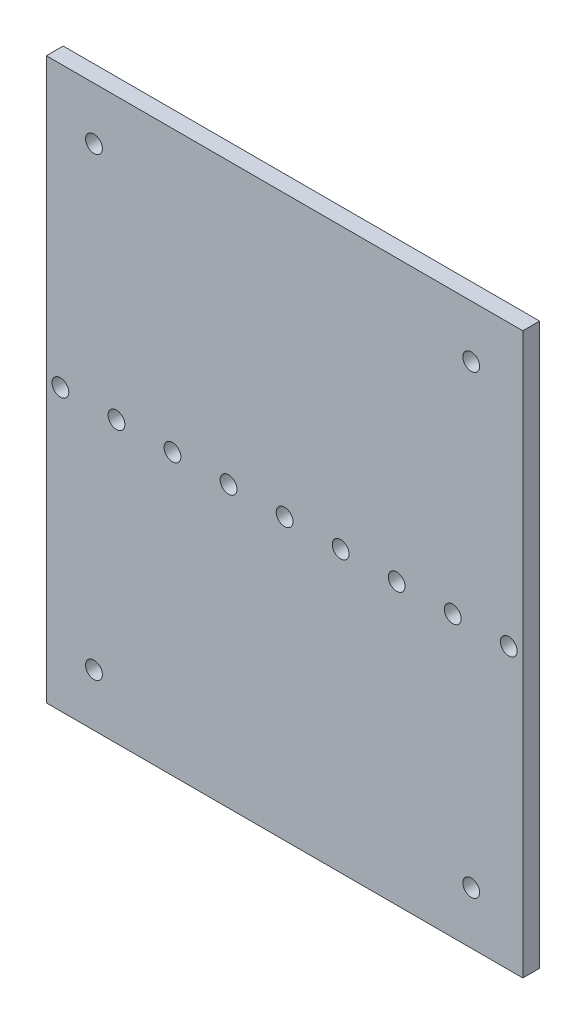
ISO-10303-21;
HEADER;
FILE_DESCRIPTION(('STEP AP214'),'2;1');
FILE_NAME('part.step','',(''),(''),'','','');
FILE_SCHEMA(('AUTOMOTIVE_DESIGN { 1 0 10303 214 1 1 1 1 }'));
ENDSEC;
DATA;
#1=APPLICATION_CONTEXT('core data for automotive mechanical design processes');
#2=APPLICATION_PROTOCOL_DEFINITION('international standard','automotive_design',2000,#1);
#3=PRODUCT_CONTEXT('',#1,'mechanical');
#4=PRODUCT('Part','Part','',(#3));
#5=PRODUCT_RELATED_PRODUCT_CATEGORY('part','',(#4));
#6=PRODUCT_DEFINITION_FORMATION('','',#4);
#7=PRODUCT_DEFINITION_CONTEXT('part definition',#1,'design');
#8=PRODUCT_DEFINITION('design','',#6,#7);
#9=PRODUCT_DEFINITION_SHAPE('','',#8);
#10=(LENGTH_UNIT() NAMED_UNIT(*) SI_UNIT(.MILLI.,.METRE.));
#11=(NAMED_UNIT(*) PLANE_ANGLE_UNIT() SI_UNIT($,.RADIAN.));
#12=(NAMED_UNIT(*) SI_UNIT($,.STERADIAN.) SOLID_ANGLE_UNIT());
#13=UNCERTAINTY_MEASURE_WITH_UNIT(LENGTH_MEASURE(1.E-05),#10,'distance_accuracy_value','');
#14=(GEOMETRIC_REPRESENTATION_CONTEXT(3) GLOBAL_UNCERTAINTY_ASSIGNED_CONTEXT((#13)) GLOBAL_UNIT_ASSIGNED_CONTEXT((#10,
#11,#12)) REPRESENTATION_CONTEXT('',''));
#15=CARTESIAN_POINT('',(0.,0.,0.));
#16=DIRECTION('',(0.,0.,1.));
#17=DIRECTION('',(1.,0.,0.));
#18=AXIS2_PLACEMENT_3D('',#15,#16,#17);
#19=CARTESIAN_POINT('',(85.,50.,3.));
#20=DIRECTION('',(-1.,0.,0.));
#21=DIRECTION('',(0.,-1.,0.));
#22=AXIS2_PLACEMENT_3D('',#19,#20,#21);
#23=PLANE('',#22);
#24=DIRECTION('',(0.,1.,0.));
#25=VECTOR('',#24,1.);
#26=CARTESIAN_POINT('',(85.,50.,0.));
#27=LINE('',#26,#25);
#28=CARTESIAN_POINT('',(85.,-50.,0.));
#29=VERTEX_POINT('',#28);
#30=CARTESIAN_POINT('',(85.,50.,0.));
#31=VERTEX_POINT('',#30);
#32=EDGE_CURVE('E114',#29,#31,#27,.T.);
#33=ORIENTED_EDGE('',*,*,#32,.T.);
#34=DIRECTION('',(0.,0.,-1.));
#35=VECTOR('',#34,1.);
#36=CARTESIAN_POINT('',(85.,50.,3.));
#37=LINE('',#36,#35);
#38=CARTESIAN_POINT('',(85.,50.,3.));
#39=VERTEX_POINT('',#38);
#40=EDGE_CURVE('E11',#39,#31,#37,.T.);
#41=ORIENTED_EDGE('',*,*,#40,.F.);
#42=DIRECTION('',(0.,1.,0.));
#43=VECTOR('',#42,1.);
#44=CARTESIAN_POINT('',(85.,50.,3.));
#45=LINE('',#44,#43);
#46=CARTESIAN_POINT('',(85.,-50.,3.));
#47=VERTEX_POINT('',#46);
#48=EDGE_CURVE('E97',#47,#39,#45,.T.);
#49=ORIENTED_EDGE('',*,*,#48,.F.);
#50=DIRECTION('',(0.,0.,-1.));
#51=VECTOR('',#50,1.);
#52=CARTESIAN_POINT('',(85.,-50.,3.));
#53=LINE('',#52,#51);
#54=EDGE_CURVE('E110',#47,#29,#53,.T.);
#55=ORIENTED_EDGE('',*,*,#54,.T.);
#56=EDGE_LOOP('',(#33,#41,#49,#55));
#57=FACE_BOUND('',#56,.T.);
#58=ADVANCED_FACE('F43',(#57),#23,.F.);
#59=CARTESIAN_POINT('',(0.,50.,3.));
#60=DIRECTION('',(0.,-1.,0.));
#61=DIRECTION('',(0.,0.,-1.));
#62=AXIS2_PLACEMENT_3D('',#59,#60,#61);
#63=PLANE('',#62);
#64=DIRECTION('',(-1.,0.,0.));
#65=VECTOR('',#64,1.);
#66=CARTESIAN_POINT('',(0.,50.,0.));
#67=LINE('',#66,#65);
#68=CARTESIAN_POINT('',(0.,50.,0.));
#69=VERTEX_POINT('',#68);
#70=EDGE_CURVE('E102',#31,#69,#67,.T.);
#71=ORIENTED_EDGE('',*,*,#70,.T.);
#72=DIRECTION('',(0.,0.,-1.));
#73=VECTOR('',#72,1.);
#74=CARTESIAN_POINT('',(0.,50.,3.));
#75=LINE('',#74,#73);
#76=CARTESIAN_POINT('',(0.,50.,3.));
#77=VERTEX_POINT('',#76);
#78=EDGE_CURVE('E53',#77,#69,#75,.T.);
#79=ORIENTED_EDGE('',*,*,#78,.F.);
#80=DIRECTION('',(-1.,0.,0.));
#81=VECTOR('',#80,1.);
#82=CARTESIAN_POINT('',(0.,50.,3.));
#83=LINE('',#82,#81);
#84=EDGE_CURVE('E92',#39,#77,#83,.T.);
#85=ORIENTED_EDGE('',*,*,#84,.F.);
#86=ORIENTED_EDGE('',*,*,#40,.T.);
#87=EDGE_LOOP('',(#71,#79,#85,#86));
#88=FACE_BOUND('',#87,.T.);
#89=ADVANCED_FACE('F101',(#88),#63,.F.);
#90=CARTESIAN_POINT('',(0.,50.,3.));
#91=DIRECTION('',(1.,0.,0.));
#92=DIRECTION('',(0.,1.,0.));
#93=AXIS2_PLACEMENT_3D('',#90,#91,#92);
#94=PLANE('',#93);
#95=DIRECTION('',(0.,-1.,0.));
#96=VECTOR('',#95,1.);
#97=CARTESIAN_POINT('',(0.,50.,0.));
#98=LINE('',#97,#96);
#99=CARTESIAN_POINT('',(0.,-50.,0.));
#100=VERTEX_POINT('',#99);
#101=EDGE_CURVE('E79',#69,#100,#98,.T.);
#102=ORIENTED_EDGE('',*,*,#101,.T.);
#103=DIRECTION('',(0.,0.,-1.));
#104=VECTOR('',#103,1.);
#105=CARTESIAN_POINT('',(0.,-50.,3.));
#106=LINE('',#105,#104);
#107=CARTESIAN_POINT('',(0.,-50.,3.));
#108=VERTEX_POINT('',#107);
#109=EDGE_CURVE('E104',#108,#100,#106,.T.);
#110=ORIENTED_EDGE('',*,*,#109,.F.);
#111=DIRECTION('',(0.,-1.,0.));
#112=VECTOR('',#111,1.);
#113=CARTESIAN_POINT('',(0.,50.,3.));
#114=LINE('',#113,#112);
#115=EDGE_CURVE('E95',#77,#108,#114,.T.);
#116=ORIENTED_EDGE('',*,*,#115,.F.);
#117=ORIENTED_EDGE('',*,*,#78,.T.);
#118=EDGE_LOOP('',(#102,#110,#116,#117));
#119=FACE_BOUND('',#118,.T.);
#120=ADVANCED_FACE('F106',(#119),#94,.F.);
#121=CARTESIAN_POINT('',(0.,-50.,3.));
#122=DIRECTION('',(0.,1.,0.));
#123=DIRECTION('',(0.,0.,1.));
#124=AXIS2_PLACEMENT_3D('',#121,#122,#123);
#125=PLANE('',#124);
#126=DIRECTION('',(1.,0.,0.));
#127=VECTOR('',#126,1.);
#128=CARTESIAN_POINT('',(0.,-50.,0.));
#129=LINE('',#128,#127);
#130=EDGE_CURVE('E85',#100,#29,#129,.T.);
#131=ORIENTED_EDGE('',*,*,#130,.T.);
#132=ORIENTED_EDGE('',*,*,#54,.F.);
#133=DIRECTION('',(1.,0.,0.));
#134=VECTOR('',#133,1.);
#135=CARTESIAN_POINT('',(0.,-50.,3.));
#136=LINE('',#135,#134);
#137=EDGE_CURVE('E62',#108,#47,#136,.T.);
#138=ORIENTED_EDGE('',*,*,#137,.F.);
#139=ORIENTED_EDGE('',*,*,#109,.T.);
#140=EDGE_LOOP('',(#131,#132,#138,#139));
#141=FACE_BOUND('',#140,.T.);
#142=ADVANCED_FACE('F209',(#141),#125,.F.);
#143=CARTESIAN_POINT('',(0.,0.,3.));
#144=DIRECTION('',(0.,0.,1.));
#145=DIRECTION('',(1.,0.,0.));
#146=AXIS2_PLACEMENT_3D('',#143,#144,#145);
#147=PLANE('',#146);
#148=CARTESIAN_POINT('',(2.49999999999999,-2.79318507107451E-13,3.));
#149=DIRECTION('',(0.,0.,1.));
#150=DIRECTION('',(1.,0.,0.));
#151=AXIS2_PLACEMENT_3D('',#148,#149,#150);
#152=CIRCLE('',#151,1.5);
#153=CARTESIAN_POINT('',(3.99999999999999,-2.79318507107451E-13,3.));
#154=VERTEX_POINT('',#153);
#155=EDGE_CURVE('E428',#154,#154,#152,.T.);
#156=ORIENTED_EDGE('',*,*,#155,.F.);
#157=EDGE_LOOP('',(#156));
#158=FACE_BOUND('',#157,.T.);
#159=CARTESIAN_POINT('',(12.5,-2.09488880330588E-13,3.));
#160=DIRECTION('',(0.,0.,1.));
#161=DIRECTION('',(1.,0.,0.));
#162=AXIS2_PLACEMENT_3D('',#159,#160,#161);
#163=CIRCLE('',#162,1.5);
#164=CARTESIAN_POINT('',(14.,-2.09488880330588E-13,3.));
#165=VERTEX_POINT('',#164);
#166=EDGE_CURVE('E430',#165,#165,#163,.T.);
#167=ORIENTED_EDGE('',*,*,#166,.F.);
#168=EDGE_LOOP('',(#167));
#169=FACE_BOUND('',#168,.T.);
#170=CARTESIAN_POINT('',(22.5,-1.39659253553725E-13,3.));
#171=DIRECTION('',(0.,0.,1.));
#172=DIRECTION('',(1.,0.,0.));
#173=AXIS2_PLACEMENT_3D('',#170,#171,#172);
#174=CIRCLE('',#173,1.5);
#175=CARTESIAN_POINT('',(24.,-1.39659253553725E-13,3.));
#176=VERTEX_POINT('',#175);
#177=EDGE_CURVE('E433',#176,#176,#174,.T.);
#178=ORIENTED_EDGE('',*,*,#177,.F.);
#179=EDGE_LOOP('',(#178));
#180=FACE_BOUND('',#179,.T.);
#181=CARTESIAN_POINT('',(32.5,0.,3.));
#182=DIRECTION('',(0.,0.,1.));
#183=DIRECTION('',(1.,0.,0.));
#184=AXIS2_PLACEMENT_3D('',#181,#182,#183);
#185=CIRCLE('',#184,1.5);
#186=CARTESIAN_POINT('',(34.,0.,3.));
#187=VERTEX_POINT('',#186);
#188=EDGE_CURVE('E439',#187,#187,#185,.T.);
#189=ORIENTED_EDGE('',*,*,#188,.F.);
#190=EDGE_LOOP('',(#189));
#191=FACE_BOUND('',#190,.T.);
#192=CARTESIAN_POINT('',(82.5,0.,3.));
#193=DIRECTION('',(0.,0.,1.));
#194=DIRECTION('',(1.,0.,0.));
#195=AXIS2_PLACEMENT_3D('',#192,#193,#194);
#196=CIRCLE('',#195,1.5);
#197=CARTESIAN_POINT('',(84.,0.,3.));
#198=VERTEX_POINT('',#197);
#199=EDGE_CURVE('E443',#198,#198,#196,.T.);
#200=ORIENTED_EDGE('',*,*,#199,.F.);
#201=EDGE_LOOP('',(#200));
#202=FACE_BOUND('',#201,.T.);
#203=CARTESIAN_POINT('',(72.5,0.,3.));
#204=DIRECTION('',(0.,0.,1.));
#205=DIRECTION('',(1.,0.,0.));
#206=AXIS2_PLACEMENT_3D('',#203,#204,#205);
#207=CIRCLE('',#206,1.50000000000001);
#208=CARTESIAN_POINT('',(74.,0.,3.));
#209=VERTEX_POINT('',#208);
#210=EDGE_CURVE('E447',#209,#209,#207,.T.);
#211=ORIENTED_EDGE('',*,*,#210,.F.);
#212=EDGE_LOOP('',(#211));
#213=FACE_BOUND('',#212,.T.);
#214=CARTESIAN_POINT('',(62.5,0.,3.));
#215=DIRECTION('',(0.,0.,1.));
#216=DIRECTION('',(1.,0.,0.));
#217=AXIS2_PLACEMENT_3D('',#214,#215,#216);
#218=CIRCLE('',#217,1.50000000000001);
#219=CARTESIAN_POINT('',(64.,0.,3.));
#220=VERTEX_POINT('',#219);
#221=EDGE_CURVE('E451',#220,#220,#218,.T.);
#222=ORIENTED_EDGE('',*,*,#221,.F.);
#223=EDGE_LOOP('',(#222));
#224=FACE_BOUND('',#223,.T.);
#225=CARTESIAN_POINT('',(52.5,0.,3.));
#226=DIRECTION('',(0.,0.,1.));
#227=DIRECTION('',(1.,0.,0.));
#228=AXIS2_PLACEMENT_3D('',#225,#226,#227);
#229=CIRCLE('',#228,1.5);
#230=CARTESIAN_POINT('',(54.,0.,3.));
#231=VERTEX_POINT('',#230);
#232=EDGE_CURVE('E455',#231,#231,#229,.T.);
#233=ORIENTED_EDGE('',*,*,#232,.F.);
#234=EDGE_LOOP('',(#233));
#235=FACE_BOUND('',#234,.T.);
#236=CARTESIAN_POINT('',(42.5,0.,3.));
#237=DIRECTION('',(0.,0.,1.));
#238=DIRECTION('',(1.,0.,0.));
#239=AXIS2_PLACEMENT_3D('',#236,#237,#238);
#240=CIRCLE('',#239,1.5);
#241=CARTESIAN_POINT('',(44.,0.,3.));
#242=VERTEX_POINT('',#241);
#243=EDGE_CURVE('E150',#242,#242,#240,.T.);
#244=ORIENTED_EDGE('',*,*,#243,.F.);
#245=EDGE_LOOP('',(#244));
#246=FACE_BOUND('',#245,.T.);
#247=CARTESIAN_POINT('',(75.8,-40.64,3.));
#248=DIRECTION('',(0.,0.,1.));
#249=DIRECTION('',(1.,0.,0.));
#250=AXIS2_PLACEMENT_3D('',#247,#248,#249);
#251=CIRCLE('',#250,1.5);
#252=CARTESIAN_POINT('',(77.3,-40.64,3.));
#253=VERTEX_POINT('',#252);
#254=EDGE_CURVE('E191',#253,#253,#251,.T.);
#255=ORIENTED_EDGE('',*,*,#254,.F.);
#256=EDGE_LOOP('',(#255));
#257=FACE_BOUND('',#256,.T.);
#258=CARTESIAN_POINT('',(8.48999999999998,40.64,3.));
#259=DIRECTION('',(0.,0.,1.));
#260=DIRECTION('',(1.,0.,0.));
#261=AXIS2_PLACEMENT_3D('',#258,#259,#260);
#262=CIRCLE('',#261,1.5);
#263=CARTESIAN_POINT('',(9.98999999999998,40.64,3.));
#264=VERTEX_POINT('',#263);
#265=EDGE_CURVE('E185',#264,#264,#262,.T.);
#266=ORIENTED_EDGE('',*,*,#265,.F.);
#267=EDGE_LOOP('',(#266));
#268=FACE_BOUND('',#267,.T.);
#269=CARTESIAN_POINT('',(8.49,-40.64,3.));
#270=DIRECTION('',(0.,0.,1.));
#271=DIRECTION('',(1.,0.,0.));
#272=AXIS2_PLACEMENT_3D('',#269,#270,#271);
#273=CIRCLE('',#272,1.5);
#274=CARTESIAN_POINT('',(9.99,-40.64,3.));
#275=VERTEX_POINT('',#274);
#276=EDGE_CURVE('E180',#275,#275,#273,.T.);
#277=ORIENTED_EDGE('',*,*,#276,.F.);
#278=EDGE_LOOP('',(#277));
#279=FACE_BOUND('',#278,.T.);
#280=CARTESIAN_POINT('',(75.8,40.64,3.));
#281=DIRECTION('',(0.,0.,1.));
#282=DIRECTION('',(1.,0.,0.));
#283=AXIS2_PLACEMENT_3D('',#280,#281,#282);
#284=CIRCLE('',#283,1.5);
#285=CARTESIAN_POINT('',(77.3,40.64,3.));
#286=VERTEX_POINT('',#285);
#287=EDGE_CURVE('E134',#286,#286,#284,.T.);
#288=ORIENTED_EDGE('',*,*,#287,.F.);
#289=EDGE_LOOP('',(#288));
#290=FACE_BOUND('',#289,.T.);
#291=ORIENTED_EDGE('',*,*,#48,.T.);
#292=ORIENTED_EDGE('',*,*,#84,.T.);
#293=ORIENTED_EDGE('',*,*,#115,.T.);
#294=ORIENTED_EDGE('',*,*,#137,.T.);
#295=EDGE_LOOP('',(#291,#292,#293,#294));
#296=FACE_BOUND('',#295,.T.);
#297=ADVANCED_FACE('F93',(#158,#169,#180,#191,#202,#213,#224,#235,#246,#257,#268,#279,#290,
#296),#147,.T.);
#298=CARTESIAN_POINT('',(0.,0.,0.));
#299=DIRECTION('',(0.,0.,1.));
#300=DIRECTION('',(1.,0.,0.));
#301=AXIS2_PLACEMENT_3D('',#298,#299,#300);
#302=PLANE('',#301);
#303=CARTESIAN_POINT('',(2.49999999999999,-2.79318507107451E-13,0.));
#304=DIRECTION('',(0.,0.,1.));
#305=DIRECTION('',(1.,0.,0.));
#306=AXIS2_PLACEMENT_3D('',#303,#304,#305);
#307=CIRCLE('',#306,1.5);
#308=CARTESIAN_POINT('',(3.99999999999999,-2.79318507107451E-13,0.));
#309=VERTEX_POINT('',#308);
#310=EDGE_CURVE('E46',#309,#309,#307,.T.);
#311=ORIENTED_EDGE('',*,*,#310,.T.);
#312=EDGE_LOOP('',(#311));
#313=FACE_BOUND('',#312,.T.);
#314=CARTESIAN_POINT('',(12.5,-2.09488880330588E-13,0.));
#315=DIRECTION('',(0.,0.,1.));
#316=DIRECTION('',(1.,0.,0.));
#317=AXIS2_PLACEMENT_3D('',#314,#315,#316);
#318=CIRCLE('',#317,1.5);
#319=CARTESIAN_POINT('',(14.,-2.09488880330588E-13,0.));
#320=VERTEX_POINT('',#319);
#321=EDGE_CURVE('E173',#320,#320,#318,.T.);
#322=ORIENTED_EDGE('',*,*,#321,.T.);
#323=EDGE_LOOP('',(#322));
#324=FACE_BOUND('',#323,.T.);
#325=CARTESIAN_POINT('',(22.5,-1.39659253553725E-13,0.));
#326=DIRECTION('',(0.,0.,1.));
#327=DIRECTION('',(1.,0.,0.));
#328=AXIS2_PLACEMENT_3D('',#325,#326,#327);
#329=CIRCLE('',#328,1.5);
#330=CARTESIAN_POINT('',(24.,-1.39659253553725E-13,0.));
#331=VERTEX_POINT('',#330);
#332=EDGE_CURVE('E170',#331,#331,#329,.T.);
#333=ORIENTED_EDGE('',*,*,#332,.T.);
#334=EDGE_LOOP('',(#333));
#335=FACE_BOUND('',#334,.T.);
#336=CARTESIAN_POINT('',(32.5,0.,0.));
#337=DIRECTION('',(0.,0.,1.));
#338=DIRECTION('',(1.,0.,0.));
#339=AXIS2_PLACEMENT_3D('',#336,#337,#338);
#340=CIRCLE('',#339,1.5);
#341=CARTESIAN_POINT('',(34.,0.,0.));
#342=VERTEX_POINT('',#341);
#343=EDGE_CURVE('E166',#342,#342,#340,.T.);
#344=ORIENTED_EDGE('',*,*,#343,.T.);
#345=EDGE_LOOP('',(#344));
#346=FACE_BOUND('',#345,.T.);
#347=CARTESIAN_POINT('',(82.5,0.,0.));
#348=DIRECTION('',(0.,0.,1.));
#349=DIRECTION('',(1.,0.,0.));
#350=AXIS2_PLACEMENT_3D('',#347,#348,#349);
#351=CIRCLE('',#350,1.5);
#352=CARTESIAN_POINT('',(84.,0.,0.));
#353=VERTEX_POINT('',#352);
#354=EDGE_CURVE('E162',#353,#353,#351,.T.);
#355=ORIENTED_EDGE('',*,*,#354,.T.);
#356=EDGE_LOOP('',(#355));
#357=FACE_BOUND('',#356,.T.);
#358=CARTESIAN_POINT('',(72.5,0.,0.));
#359=DIRECTION('',(0.,0.,1.));
#360=DIRECTION('',(1.,0.,0.));
#361=AXIS2_PLACEMENT_3D('',#358,#359,#360);
#362=CIRCLE('',#361,1.50000000000001);
#363=CARTESIAN_POINT('',(74.,0.,0.));
#364=VERTEX_POINT('',#363);
#365=EDGE_CURVE('E158',#364,#364,#362,.T.);
#366=ORIENTED_EDGE('',*,*,#365,.T.);
#367=EDGE_LOOP('',(#366));
#368=FACE_BOUND('',#367,.T.);
#369=CARTESIAN_POINT('',(62.5,0.,0.));
#370=DIRECTION('',(0.,0.,1.));
#371=DIRECTION('',(1.,0.,0.));
#372=AXIS2_PLACEMENT_3D('',#369,#370,#371);
#373=CIRCLE('',#372,1.50000000000001);
#374=CARTESIAN_POINT('',(64.,0.,0.));
#375=VERTEX_POINT('',#374);
#376=EDGE_CURVE('E154',#375,#375,#373,.T.);
#377=ORIENTED_EDGE('',*,*,#376,.T.);
#378=EDGE_LOOP('',(#377));
#379=FACE_BOUND('',#378,.T.);
#380=CARTESIAN_POINT('',(52.5,0.,0.));
#381=DIRECTION('',(0.,0.,1.));
#382=DIRECTION('',(1.,0.,0.));
#383=AXIS2_PLACEMENT_3D('',#380,#381,#382);
#384=CIRCLE('',#383,1.5);
#385=CARTESIAN_POINT('',(54.,0.,0.));
#386=VERTEX_POINT('',#385);
#387=EDGE_CURVE('E149',#386,#386,#384,.T.);
#388=ORIENTED_EDGE('',*,*,#387,.T.);
#389=EDGE_LOOP('',(#388));
#390=FACE_BOUND('',#389,.T.);
#391=CARTESIAN_POINT('',(42.5,0.,0.));
#392=DIRECTION('',(0.,0.,1.));
#393=DIRECTION('',(1.,0.,0.));
#394=AXIS2_PLACEMENT_3D('',#391,#392,#393);
#395=CIRCLE('',#394,1.5);
#396=CARTESIAN_POINT('',(44.,0.,0.));
#397=VERTEX_POINT('',#396);
#398=EDGE_CURVE('E145',#397,#397,#395,.T.);
#399=ORIENTED_EDGE('',*,*,#398,.T.);
#400=EDGE_LOOP('',(#399));
#401=FACE_BOUND('',#400,.T.);
#402=CARTESIAN_POINT('',(75.8,-40.64,0.));
#403=DIRECTION('',(0.,0.,1.));
#404=DIRECTION('',(1.,0.,0.));
#405=AXIS2_PLACEMENT_3D('',#402,#403,#404);
#406=CIRCLE('',#405,1.5);
#407=CARTESIAN_POINT('',(77.3,-40.64,0.));
#408=VERTEX_POINT('',#407);
#409=EDGE_CURVE('E118',#408,#408,#406,.T.);
#410=ORIENTED_EDGE('',*,*,#409,.T.);
#411=EDGE_LOOP('',(#410));
#412=FACE_BOUND('',#411,.T.);
#413=CARTESIAN_POINT('',(8.48999999999998,40.64,0.));
#414=DIRECTION('',(0.,0.,1.));
#415=DIRECTION('',(1.,0.,0.));
#416=AXIS2_PLACEMENT_3D('',#413,#414,#415);
#417=CIRCLE('',#416,1.5);
#418=CARTESIAN_POINT('',(9.98999999999998,40.64,0.));
#419=VERTEX_POINT('',#418);
#420=EDGE_CURVE('E138',#419,#419,#417,.T.);
#421=ORIENTED_EDGE('',*,*,#420,.T.);
#422=EDGE_LOOP('',(#421));
#423=FACE_BOUND('',#422,.T.);
#424=CARTESIAN_POINT('',(8.49,-40.64,0.));
#425=DIRECTION('',(0.,0.,1.));
#426=DIRECTION('',(1.,0.,0.));
#427=AXIS2_PLACEMENT_3D('',#424,#425,#426);
#428=CIRCLE('',#427,1.5);
#429=CARTESIAN_POINT('',(9.99,-40.64,0.));
#430=VERTEX_POINT('',#429);
#431=EDGE_CURVE('E133',#430,#430,#428,.T.);
#432=ORIENTED_EDGE('',*,*,#431,.T.);
#433=EDGE_LOOP('',(#432));
#434=FACE_BOUND('',#433,.T.);
#435=CARTESIAN_POINT('',(75.8,40.64,0.));
#436=DIRECTION('',(0.,0.,1.));
#437=DIRECTION('',(1.,0.,0.));
#438=AXIS2_PLACEMENT_3D('',#435,#436,#437);
#439=CIRCLE('',#438,1.5);
#440=CARTESIAN_POINT('',(77.3,40.64,0.));
#441=VERTEX_POINT('',#440);
#442=EDGE_CURVE('E129',#441,#441,#439,.T.);
#443=ORIENTED_EDGE('',*,*,#442,.T.);
#444=EDGE_LOOP('',(#443));
#445=FACE_BOUND('',#444,.T.);
#446=ORIENTED_EDGE('',*,*,#32,.F.);
#447=ORIENTED_EDGE('',*,*,#130,.F.);
#448=ORIENTED_EDGE('',*,*,#101,.F.);
#449=ORIENTED_EDGE('',*,*,#70,.F.);
#450=EDGE_LOOP('',(#446,#447,#448,#449));
#451=FACE_BOUND('',#450,.T.);
#452=ADVANCED_FACE('F208',(#313,#324,#335,#346,#357,#368,#379,#390,#401,#412,#423,#434,#445,
#451),#302,.F.);
#453=CARTESIAN_POINT('',(75.8,40.64,-1.));
#454=DIRECTION('',(0.,0.,1.));
#455=DIRECTION('',(1.,0.,0.));
#456=AXIS2_PLACEMENT_3D('',#453,#454,#455);
#457=CYLINDRICAL_SURFACE('',#456,1.5);
#458=ORIENTED_EDGE('',*,*,#287,.T.);
#459=EDGE_LOOP('',(#458));
#460=FACE_BOUND('',#459,.T.);
#461=ORIENTED_EDGE('',*,*,#442,.F.);
#462=EDGE_LOOP('',(#461));
#463=FACE_BOUND('',#462,.T.);
#464=ADVANCED_FACE('F204',(#460,#463),#457,.F.);
#465=CARTESIAN_POINT('',(8.49,-40.64,-1.));
#466=DIRECTION('',(0.,0.,1.));
#467=DIRECTION('',(1.,0.,0.));
#468=AXIS2_PLACEMENT_3D('',#465,#466,#467);
#469=CYLINDRICAL_SURFACE('',#468,1.5);
#470=ORIENTED_EDGE('',*,*,#276,.T.);
#471=EDGE_LOOP('',(#470));
#472=FACE_BOUND('',#471,.T.);
#473=ORIENTED_EDGE('',*,*,#431,.F.);
#474=EDGE_LOOP('',(#473));
#475=FACE_BOUND('',#474,.T.);
#476=ADVANCED_FACE('F249',(#472,#475),#469,.F.);
#477=CARTESIAN_POINT('',(8.48999999999998,40.64,-1.));
#478=DIRECTION('',(0.,0.,1.));
#479=DIRECTION('',(1.,0.,0.));
#480=AXIS2_PLACEMENT_3D('',#477,#478,#479);
#481=CYLINDRICAL_SURFACE('',#480,1.5);
#482=ORIENTED_EDGE('',*,*,#265,.T.);
#483=EDGE_LOOP('',(#482));
#484=FACE_BOUND('',#483,.T.);
#485=ORIENTED_EDGE('',*,*,#420,.F.);
#486=EDGE_LOOP('',(#485));
#487=FACE_BOUND('',#486,.T.);
#488=ADVANCED_FACE('F259',(#484,#487),#481,.F.);
#489=CARTESIAN_POINT('',(75.8,-40.64,-1.));
#490=DIRECTION('',(0.,0.,1.));
#491=DIRECTION('',(1.,0.,0.));
#492=AXIS2_PLACEMENT_3D('',#489,#490,#491);
#493=CYLINDRICAL_SURFACE('',#492,1.5);
#494=ORIENTED_EDGE('',*,*,#254,.T.);
#495=EDGE_LOOP('',(#494));
#496=FACE_BOUND('',#495,.T.);
#497=ORIENTED_EDGE('',*,*,#409,.F.);
#498=EDGE_LOOP('',(#497));
#499=FACE_BOUND('',#498,.T.);
#500=ADVANCED_FACE('F269',(#496,#499),#493,.F.);
#501=CARTESIAN_POINT('',(42.5,0.,-7.));
#502=DIRECTION('',(0.,0.,1.));
#503=DIRECTION('',(1.,0.,0.));
#504=AXIS2_PLACEMENT_3D('',#501,#502,#503);
#505=CYLINDRICAL_SURFACE('',#504,1.5);
#506=ORIENTED_EDGE('',*,*,#243,.T.);
#507=EDGE_LOOP('',(#506));
#508=FACE_BOUND('',#507,.T.);
#509=ORIENTED_EDGE('',*,*,#398,.F.);
#510=EDGE_LOOP('',(#509));
#511=FACE_BOUND('',#510,.T.);
#512=ADVANCED_FACE('F279',(#508,#511),#505,.F.);
#513=CARTESIAN_POINT('',(52.5,0.,-7.));
#514=DIRECTION('',(0.,0.,1.));
#515=DIRECTION('',(1.,0.,0.));
#516=AXIS2_PLACEMENT_3D('',#513,#514,#515);
#517=CYLINDRICAL_SURFACE('',#516,1.5);
#518=ORIENTED_EDGE('',*,*,#232,.T.);
#519=EDGE_LOOP('',(#518));
#520=FACE_BOUND('',#519,.T.);
#521=ORIENTED_EDGE('',*,*,#387,.F.);
#522=EDGE_LOOP('',(#521));
#523=FACE_BOUND('',#522,.T.);
#524=ADVANCED_FACE('F301',(#520,#523),#517,.F.);
#525=CARTESIAN_POINT('',(62.5,0.,-7.));
#526=DIRECTION('',(0.,0.,1.));
#527=DIRECTION('',(1.,0.,0.));
#528=AXIS2_PLACEMENT_3D('',#525,#526,#527);
#529=CYLINDRICAL_SURFACE('',#528,1.50000000000001);
#530=ORIENTED_EDGE('',*,*,#221,.T.);
#531=EDGE_LOOP('',(#530));
#532=FACE_BOUND('',#531,.T.);
#533=ORIENTED_EDGE('',*,*,#376,.F.);
#534=EDGE_LOOP('',(#533));
#535=FACE_BOUND('',#534,.T.);
#536=ADVANCED_FACE('F312',(#532,#535),#529,.F.);
#537=CARTESIAN_POINT('',(72.5,0.,-7.));
#538=DIRECTION('',(0.,0.,1.));
#539=DIRECTION('',(1.,0.,0.));
#540=AXIS2_PLACEMENT_3D('',#537,#538,#539);
#541=CYLINDRICAL_SURFACE('',#540,1.50000000000001);
#542=ORIENTED_EDGE('',*,*,#210,.T.);
#543=EDGE_LOOP('',(#542));
#544=FACE_BOUND('',#543,.T.);
#545=ORIENTED_EDGE('',*,*,#365,.F.);
#546=EDGE_LOOP('',(#545));
#547=FACE_BOUND('',#546,.T.);
#548=ADVANCED_FACE('F323',(#544,#547),#541,.F.);
#549=CARTESIAN_POINT('',(82.5,0.,-7.));
#550=DIRECTION('',(0.,0.,1.));
#551=DIRECTION('',(1.,0.,0.));
#552=AXIS2_PLACEMENT_3D('',#549,#550,#551);
#553=CYLINDRICAL_SURFACE('',#552,1.5);
#554=ORIENTED_EDGE('',*,*,#199,.T.);
#555=EDGE_LOOP('',(#554));
#556=FACE_BOUND('',#555,.T.);
#557=ORIENTED_EDGE('',*,*,#354,.F.);
#558=EDGE_LOOP('',(#557));
#559=FACE_BOUND('',#558,.T.);
#560=ADVANCED_FACE('F334',(#556,#559),#553,.F.);
#561=CARTESIAN_POINT('',(32.5,0.,-7.));
#562=DIRECTION('',(0.,0.,1.));
#563=DIRECTION('',(1.,0.,0.));
#564=AXIS2_PLACEMENT_3D('',#561,#562,#563);
#565=CYLINDRICAL_SURFACE('',#564,1.5);
#566=ORIENTED_EDGE('',*,*,#188,.T.);
#567=EDGE_LOOP('',(#566));
#568=FACE_BOUND('',#567,.T.);
#569=ORIENTED_EDGE('',*,*,#343,.F.);
#570=EDGE_LOOP('',(#569));
#571=FACE_BOUND('',#570,.T.);
#572=ADVANCED_FACE('F345',(#568,#571),#565,.F.);
#573=CARTESIAN_POINT('',(22.5,-1.39659253553725E-13,-7.));
#574=DIRECTION('',(0.,0.,1.));
#575=DIRECTION('',(1.,0.,0.));
#576=AXIS2_PLACEMENT_3D('',#573,#574,#575);
#577=CYLINDRICAL_SURFACE('',#576,1.5);
#578=ORIENTED_EDGE('',*,*,#177,.T.);
#579=EDGE_LOOP('',(#578));
#580=FACE_BOUND('',#579,.T.);
#581=ORIENTED_EDGE('',*,*,#332,.F.);
#582=EDGE_LOOP('',(#581));
#583=FACE_BOUND('',#582,.T.);
#584=ADVANCED_FACE('F356',(#580,#583),#577,.F.);
#585=CARTESIAN_POINT('',(12.5,-2.09488880330588E-13,-7.));
#586=DIRECTION('',(0.,0.,1.));
#587=DIRECTION('',(1.,0.,0.));
#588=AXIS2_PLACEMENT_3D('',#585,#586,#587);
#589=CYLINDRICAL_SURFACE('',#588,1.5);
#590=ORIENTED_EDGE('',*,*,#166,.T.);
#591=EDGE_LOOP('',(#590));
#592=FACE_BOUND('',#591,.T.);
#593=ORIENTED_EDGE('',*,*,#321,.F.);
#594=EDGE_LOOP('',(#593));
#595=FACE_BOUND('',#594,.T.);
#596=ADVANCED_FACE('F367',(#592,#595),#589,.F.);
#597=CARTESIAN_POINT('',(2.49999999999999,-2.79318507107451E-13,-7.));
#598=DIRECTION('',(0.,0.,1.));
#599=DIRECTION('',(1.,0.,0.));
#600=AXIS2_PLACEMENT_3D('',#597,#598,#599);
#601=CYLINDRICAL_SURFACE('',#600,1.5);
#602=ORIENTED_EDGE('',*,*,#155,.T.);
#603=EDGE_LOOP('',(#602));
#604=FACE_BOUND('',#603,.T.);
#605=ORIENTED_EDGE('',*,*,#310,.F.);
#606=EDGE_LOOP('',(#605));
#607=FACE_BOUND('',#606,.T.);
#608=ADVANCED_FACE('F378',(#604,#607),#601,.F.);
#609=CLOSED_SHELL('',(#58,#89,#120,#142,#297,#452,#464,#476,#488,#500,#512,#524,#536,#548,#560,
#572,#584,#596,#608));
#610=MANIFOLD_SOLID_BREP('B2',#609);
#611=ADVANCED_BREP_SHAPE_REPRESENTATION('',(#18,#610),#14);
#612=SHAPE_DEFINITION_REPRESENTATION(#9,#611);
ENDSEC;
END-ISO-10303-21;
